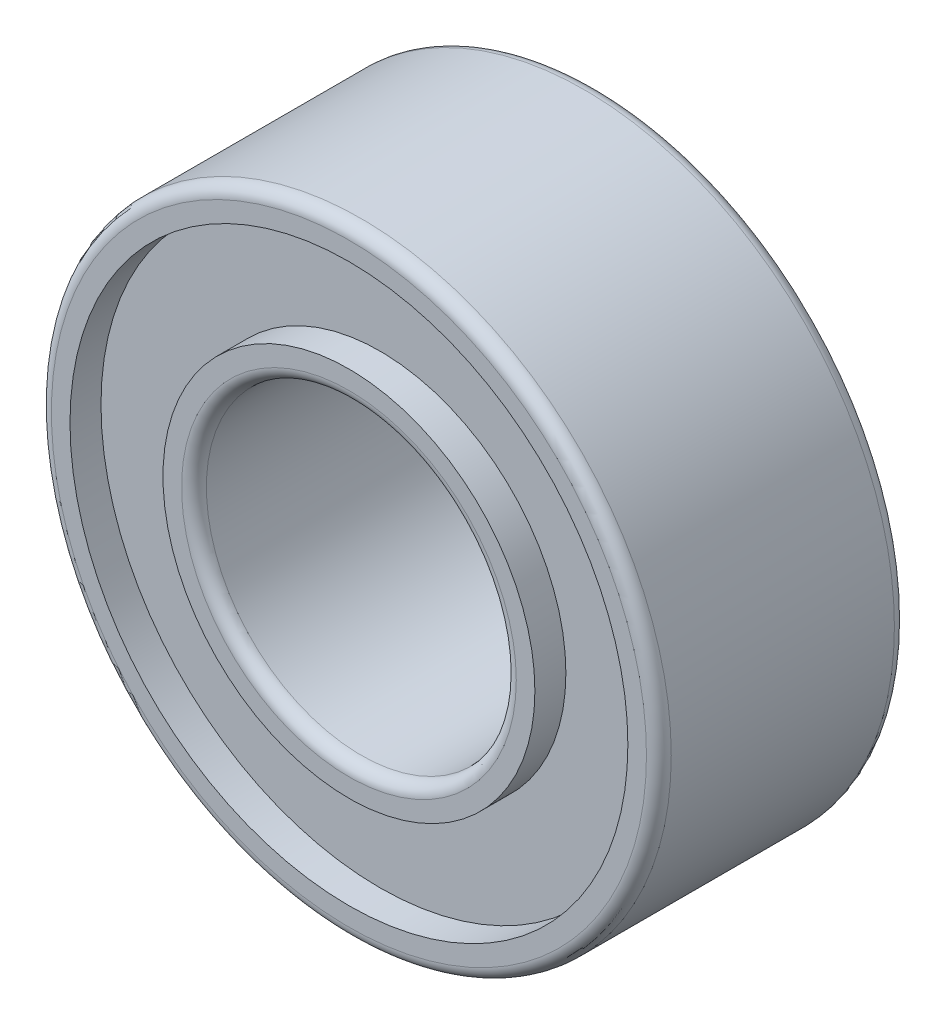
ISO-10303-21;
HEADER;
FILE_DESCRIPTION(('STEP AP214'),'2;1');
FILE_NAME('part.step','',(''),(''),'','','');
FILE_SCHEMA(('AUTOMOTIVE_DESIGN { 1 0 10303 214 1 1 1 1 }'));
ENDSEC;
DATA;
#1=APPLICATION_CONTEXT('core data for automotive mechanical design processes');
#2=APPLICATION_PROTOCOL_DEFINITION('international standard','automotive_design',2000,#1);
#3=PRODUCT_CONTEXT('',#1,'mechanical');
#4=PRODUCT('Part','Part','',(#3));
#5=PRODUCT_RELATED_PRODUCT_CATEGORY('part','',(#4));
#6=PRODUCT_DEFINITION_FORMATION('','',#4);
#7=PRODUCT_DEFINITION_CONTEXT('part definition',#1,'design');
#8=PRODUCT_DEFINITION('design','',#6,#7);
#9=PRODUCT_DEFINITION_SHAPE('','',#8);
#10=(LENGTH_UNIT() NAMED_UNIT(*) SI_UNIT(.MILLI.,.METRE.));
#11=(NAMED_UNIT(*) PLANE_ANGLE_UNIT() SI_UNIT($,.RADIAN.));
#12=(NAMED_UNIT(*) SI_UNIT($,.STERADIAN.) SOLID_ANGLE_UNIT());
#13=UNCERTAINTY_MEASURE_WITH_UNIT(LENGTH_MEASURE(1.E-05),#10,'distance_accuracy_value','');
#14=(GEOMETRIC_REPRESENTATION_CONTEXT(3) GLOBAL_UNCERTAINTY_ASSIGNED_CONTEXT((#13)) GLOBAL_UNIT_ASSIGNED_CONTEXT((#10,
#11,#12)) REPRESENTATION_CONTEXT('',''));
#15=CARTESIAN_POINT('',(0.,0.,0.));
#16=DIRECTION('',(0.,0.,1.));
#17=DIRECTION('',(1.,0.,0.));
#18=AXIS2_PLACEMENT_3D('',#15,#16,#17);
#19=CARTESIAN_POINT('',(0.,0.,4.));
#20=DIRECTION('',(0.,0.,1.));
#21=DIRECTION('',(1.,0.,0.));
#22=AXIS2_PLACEMENT_3D('',#19,#20,#21);
#23=PLANE('',#22);
#24=CARTESIAN_POINT('',(0.,0.,4.));
#25=DIRECTION('',(0.,0.,1.));
#26=DIRECTION('',(1.,0.,0.));
#27=AXIS2_PLACEMENT_3D('',#24,#25,#26);
#28=CIRCLE('',#27,2.7);
#29=CARTESIAN_POINT('',(2.7,0.,4.));
#30=VERTEX_POINT('',#29);
#31=EDGE_CURVE('E10',#30,#30,#28,.F.);
#32=ORIENTED_EDGE('',*,*,#31,.T.);
#33=EDGE_LOOP('',(#32));
#34=FACE_BOUND('',#33,.T.);
#35=CARTESIAN_POINT('',(0.,0.,4.));
#36=DIRECTION('',(0.,0.,1.));
#37=DIRECTION('',(1.,0.,0.));
#38=AXIS2_PLACEMENT_3D('',#35,#36,#37);
#39=CIRCLE('',#38,3.);
#40=CARTESIAN_POINT('',(3.,0.,4.));
#41=VERTEX_POINT('',#40);
#42=EDGE_CURVE('E85',#41,#41,#39,.T.);
#43=ORIENTED_EDGE('',*,*,#42,.T.);
#44=EDGE_LOOP('',(#43));
#45=FACE_BOUND('',#44,.T.);
#46=ADVANCED_FACE('F34',(#34,#45),#23,.T.);
#47=CARTESIAN_POINT('',(0.,0.,0.));
#48=DIRECTION('',(0.,0.,1.));
#49=DIRECTION('',(1.,0.,0.));
#50=AXIS2_PLACEMENT_3D('',#47,#48,#49);
#51=PLANE('',#50);
#52=CARTESIAN_POINT('',(0.,0.,0.));
#53=DIRECTION('',(0.,0.,1.));
#54=DIRECTION('',(1.,0.,0.));
#55=AXIS2_PLACEMENT_3D('',#52,#53,#54);
#56=CIRCLE('',#55,2.7);
#57=CARTESIAN_POINT('',(2.7,0.,0.));
#58=VERTEX_POINT('',#57);
#59=EDGE_CURVE('E60',#58,#58,#56,.T.);
#60=ORIENTED_EDGE('',*,*,#59,.T.);
#61=EDGE_LOOP('',(#60));
#62=FACE_BOUND('',#61,.T.);
#63=CARTESIAN_POINT('',(0.,0.,0.));
#64=DIRECTION('',(0.,0.,-1.));
#65=DIRECTION('',(-1.,0.,0.));
#66=AXIS2_PLACEMENT_3D('',#63,#64,#65);
#67=CIRCLE('',#66,3.);
#68=CARTESIAN_POINT('',(-3.,0.,0.));
#69=VERTEX_POINT('',#68);
#70=EDGE_CURVE('E73',#69,#69,#67,.T.);
#71=ORIENTED_EDGE('',*,*,#70,.T.);
#72=EDGE_LOOP('',(#71));
#73=FACE_BOUND('',#72,.T.);
#74=ADVANCED_FACE('F110',(#62,#73),#51,.F.);
#75=CARTESIAN_POINT('',(0.,0.,4.));
#76=DIRECTION('',(0.,0.,1.));
#77=DIRECTION('',(1.,0.,0.));
#78=AXIS2_PLACEMENT_3D('',#75,#76,#77);
#79=CIRCLE('',#78,4.5);
#80=CARTESIAN_POINT('',(4.5,0.,4.));
#81=VERTEX_POINT('',#80);
#82=EDGE_CURVE('E79',#81,#81,#79,.T.);
#83=ORIENTED_EDGE('',*,*,#82,.F.);
#84=EDGE_LOOP('',(#83));
#85=FACE_BOUND('',#84,.T.);
#86=CARTESIAN_POINT('',(0.,0.,4.));
#87=DIRECTION('',(0.,0.,1.));
#88=DIRECTION('',(1.,0.,0.));
#89=AXIS2_PLACEMENT_3D('',#86,#87,#88);
#90=CIRCLE('',#89,4.8);
#91=CARTESIAN_POINT('',(4.8,0.,4.));
#92=VERTEX_POINT('',#91);
#93=EDGE_CURVE('E41',#92,#92,#90,.T.);
#94=ORIENTED_EDGE('',*,*,#93,.T.);
#95=EDGE_LOOP('',(#94));
#96=FACE_BOUND('',#95,.T.);
#97=ADVANCED_FACE('F107',(#85,#96),#23,.T.);
#98=CARTESIAN_POINT('',(0.,0.,0.));
#99=DIRECTION('',(0.,0.,-1.));
#100=DIRECTION('',(-1.,0.,0.));
#101=AXIS2_PLACEMENT_3D('',#98,#99,#100);
#102=CIRCLE('',#101,4.5);
#103=CARTESIAN_POINT('',(-4.5,0.,0.));
#104=VERTEX_POINT('',#103);
#105=EDGE_CURVE('E67',#104,#104,#102,.T.);
#106=ORIENTED_EDGE('',*,*,#105,.F.);
#107=EDGE_LOOP('',(#106));
#108=FACE_BOUND('',#107,.T.);
#109=CARTESIAN_POINT('',(0.,0.,0.));
#110=DIRECTION('',(0.,0.,1.));
#111=DIRECTION('',(1.,0.,0.));
#112=AXIS2_PLACEMENT_3D('',#109,#110,#111);
#113=CIRCLE('',#112,4.8);
#114=CARTESIAN_POINT('',(4.8,0.,0.));
#115=VERTEX_POINT('',#114);
#116=EDGE_CURVE('E63',#115,#115,#113,.F.);
#117=ORIENTED_EDGE('',*,*,#116,.T.);
#118=EDGE_LOOP('',(#117));
#119=FACE_BOUND('',#118,.T.);
#120=ADVANCED_FACE('F109',(#108,#119),#51,.F.);
#121=CARTESIAN_POINT('',(0.,0.,4.));
#122=DIRECTION('',(0.,0.,-1.));
#123=DIRECTION('',(-1.,0.,0.));
#124=AXIS2_PLACEMENT_3D('',#121,#122,#123);
#125=CYLINDRICAL_SURFACE('',#124,5.);
#126=CARTESIAN_POINT('',(0.,0.,0.2));
#127=DIRECTION('',(0.,0.,1.));
#128=DIRECTION('',(1.,0.,0.));
#129=AXIS2_PLACEMENT_3D('',#126,#127,#128);
#130=CIRCLE('',#129,5.);
#131=CARTESIAN_POINT('',(5.,0.,0.2));
#132=VERTEX_POINT('',#131);
#133=EDGE_CURVE('E45',#132,#132,#130,.T.);
#134=ORIENTED_EDGE('',*,*,#133,.T.);
#135=EDGE_LOOP('',(#134));
#136=FACE_BOUND('',#135,.T.);
#137=CARTESIAN_POINT('',(0.,0.,3.8));
#138=DIRECTION('',(0.,0.,1.));
#139=DIRECTION('',(1.,0.,0.));
#140=AXIS2_PLACEMENT_3D('',#137,#138,#139);
#141=CIRCLE('',#140,5.);
#142=CARTESIAN_POINT('',(5.,0.,3.8));
#143=VERTEX_POINT('',#142);
#144=EDGE_CURVE('E49',#143,#143,#141,.F.);
#145=ORIENTED_EDGE('',*,*,#144,.T.);
#146=EDGE_LOOP('',(#145));
#147=FACE_BOUND('',#146,.T.);
#148=ADVANCED_FACE('F116',(#136,#147),#125,.T.);
#149=CARTESIAN_POINT('',(0.,0.,4.));
#150=DIRECTION('',(0.,0.,-1.));
#151=DIRECTION('',(-1.,0.,0.));
#152=AXIS2_PLACEMENT_3D('',#149,#150,#151);
#153=CYLINDRICAL_SURFACE('',#152,2.5);
#154=CARTESIAN_POINT('',(0.,0.,0.2));
#155=DIRECTION('',(0.,0.,1.));
#156=DIRECTION('',(1.,0.,0.));
#157=AXIS2_PLACEMENT_3D('',#154,#155,#156);
#158=CIRCLE('',#157,2.5);
#159=CARTESIAN_POINT('',(2.5,0.,0.2));
#160=VERTEX_POINT('',#159);
#161=EDGE_CURVE('E54',#160,#160,#158,.F.);
#162=ORIENTED_EDGE('',*,*,#161,.T.);
#163=EDGE_LOOP('',(#162));
#164=FACE_BOUND('',#163,.T.);
#165=CARTESIAN_POINT('',(0.,0.,3.8));
#166=DIRECTION('',(0.,0.,1.));
#167=DIRECTION('',(1.,0.,0.));
#168=AXIS2_PLACEMENT_3D('',#165,#166,#167);
#169=CIRCLE('',#168,2.5);
#170=CARTESIAN_POINT('',(2.5,0.,3.8));
#171=VERTEX_POINT('',#170);
#172=EDGE_CURVE('E57',#171,#171,#169,.T.);
#173=ORIENTED_EDGE('',*,*,#172,.T.);
#174=EDGE_LOOP('',(#173));
#175=FACE_BOUND('',#174,.T.);
#176=ADVANCED_FACE('F141',(#164,#175),#153,.F.);
#177=CARTESIAN_POINT('',(0.,0.,0.2));
#178=DIRECTION('',(0.,0.,1.));
#179=DIRECTION('',(1.,0.,0.));
#180=AXIS2_PLACEMENT_3D('',#177,#178,#179);
#181=TOROIDAL_SURFACE('',#180,2.7,0.2);
#182=ORIENTED_EDGE('',*,*,#161,.F.);
#183=EDGE_LOOP('',(#182));
#184=FACE_BOUND('',#183,.T.);
#185=ORIENTED_EDGE('',*,*,#59,.F.);
#186=EDGE_LOOP('',(#185));
#187=FACE_BOUND('',#186,.T.);
#188=ADVANCED_FACE('F143',(#184,#187),#181,.T.);
#189=CARTESIAN_POINT('',(0.,0.,0.2));
#190=DIRECTION('',(0.,0.,1.));
#191=DIRECTION('',(1.,0.,0.));
#192=AXIS2_PLACEMENT_3D('',#189,#190,#191);
#193=TOROIDAL_SURFACE('',#192,4.8,0.2);
#194=ORIENTED_EDGE('',*,*,#116,.F.);
#195=EDGE_LOOP('',(#194));
#196=FACE_BOUND('',#195,.T.);
#197=ORIENTED_EDGE('',*,*,#133,.F.);
#198=EDGE_LOOP('',(#197));
#199=FACE_BOUND('',#198,.T.);
#200=ADVANCED_FACE('F149',(#196,#199),#193,.T.);
#201=CARTESIAN_POINT('',(0.,0.,3.8));
#202=DIRECTION('',(0.,0.,1.));
#203=DIRECTION('',(1.,0.,0.));
#204=AXIS2_PLACEMENT_3D('',#201,#202,#203);
#205=TOROIDAL_SURFACE('',#204,2.7,0.2);
#206=ORIENTED_EDGE('',*,*,#31,.F.);
#207=EDGE_LOOP('',(#206));
#208=FACE_BOUND('',#207,.T.);
#209=ORIENTED_EDGE('',*,*,#172,.F.);
#210=EDGE_LOOP('',(#209));
#211=FACE_BOUND('',#210,.T.);
#212=ADVANCED_FACE('F158',(#208,#211),#205,.T.);
#213=CARTESIAN_POINT('',(0.,0.,3.8));
#214=DIRECTION('',(0.,0.,1.));
#215=DIRECTION('',(1.,0.,0.));
#216=AXIS2_PLACEMENT_3D('',#213,#214,#215);
#217=TOROIDAL_SURFACE('',#216,4.8,0.2);
#218=ORIENTED_EDGE('',*,*,#144,.F.);
#219=EDGE_LOOP('',(#218));
#220=FACE_BOUND('',#219,.T.);
#221=ORIENTED_EDGE('',*,*,#93,.F.);
#222=EDGE_LOOP('',(#221));
#223=FACE_BOUND('',#222,.T.);
#224=ADVANCED_FACE('F36',(#220,#223),#217,.T.);
#225=CARTESIAN_POINT('',(0.,0.,0.5));
#226=DIRECTION('',(0.,0.,-1.));
#227=DIRECTION('',(-1.,0.,0.));
#228=AXIS2_PLACEMENT_3D('',#225,#226,#227);
#229=CYLINDRICAL_SURFACE('',#228,4.5);
#230=CARTESIAN_POINT('',(0.,0.,0.5));
#231=DIRECTION('',(0.,0.,-1.));
#232=DIRECTION('',(-1.,0.,0.));
#233=AXIS2_PLACEMENT_3D('',#230,#231,#232);
#234=CIRCLE('',#233,4.5);
#235=CARTESIAN_POINT('',(-4.5,0.,0.5));
#236=VERTEX_POINT('',#235);
#237=EDGE_CURVE('E66',#236,#236,#234,.T.);
#238=ORIENTED_EDGE('',*,*,#237,.F.);
#239=EDGE_LOOP('',(#238));
#240=FACE_BOUND('',#239,.T.);
#241=ORIENTED_EDGE('',*,*,#105,.T.);
#242=EDGE_LOOP('',(#241));
#243=FACE_BOUND('',#242,.T.);
#244=ADVANCED_FACE('F137',(#240,#243),#229,.F.);
#245=CARTESIAN_POINT('',(0.,0.,0.5));
#246=DIRECTION('',(0.,0.,-1.));
#247=DIRECTION('',(-1.,0.,0.));
#248=AXIS2_PLACEMENT_3D('',#245,#246,#247);
#249=PLANE('',#248);
#250=CARTESIAN_POINT('',(0.,0.,0.5));
#251=DIRECTION('',(0.,0.,-1.));
#252=DIRECTION('',(-1.,0.,0.));
#253=AXIS2_PLACEMENT_3D('',#250,#251,#252);
#254=CIRCLE('',#253,3.);
#255=CARTESIAN_POINT('',(-3.,0.,0.5));
#256=VERTEX_POINT('',#255);
#257=EDGE_CURVE('E70',#256,#256,#254,.T.);
#258=ORIENTED_EDGE('',*,*,#257,.F.);
#259=EDGE_LOOP('',(#258));
#260=FACE_BOUND('',#259,.T.);
#261=ORIENTED_EDGE('',*,*,#237,.T.);
#262=EDGE_LOOP('',(#261));
#263=FACE_BOUND('',#262,.T.);
#264=ADVANCED_FACE('F133',(#260,#263),#249,.T.);
#265=CARTESIAN_POINT('',(0.,0.,0.5));
#266=DIRECTION('',(0.,0.,-1.));
#267=DIRECTION('',(-1.,0.,0.));
#268=AXIS2_PLACEMENT_3D('',#265,#266,#267);
#269=CYLINDRICAL_SURFACE('',#268,3.);
#270=ORIENTED_EDGE('',*,*,#257,.T.);
#271=EDGE_LOOP('',(#270));
#272=FACE_BOUND('',#271,.T.);
#273=ORIENTED_EDGE('',*,*,#70,.F.);
#274=EDGE_LOOP('',(#273));
#275=FACE_BOUND('',#274,.T.);
#276=ADVANCED_FACE('F103',(#272,#275),#269,.T.);
#277=CARTESIAN_POINT('',(0.,0.,3.5));
#278=DIRECTION('',(0.,0.,1.));
#279=DIRECTION('',(1.,0.,0.));
#280=AXIS2_PLACEMENT_3D('',#277,#278,#279);
#281=CYLINDRICAL_SURFACE('',#280,4.5);
#282=CARTESIAN_POINT('',(0.,0.,3.5));
#283=DIRECTION('',(0.,0.,1.));
#284=DIRECTION('',(1.,0.,0.));
#285=AXIS2_PLACEMENT_3D('',#282,#283,#284);
#286=CIRCLE('',#285,4.5);
#287=CARTESIAN_POINT('',(4.5,0.,3.5));
#288=VERTEX_POINT('',#287);
#289=EDGE_CURVE('E76',#288,#288,#286,.T.);
#290=ORIENTED_EDGE('',*,*,#289,.F.);
#291=EDGE_LOOP('',(#290));
#292=FACE_BOUND('',#291,.T.);
#293=ORIENTED_EDGE('',*,*,#82,.T.);
#294=EDGE_LOOP('',(#293));
#295=FACE_BOUND('',#294,.T.);
#296=ADVANCED_FACE('F97',(#292,#295),#281,.F.);
#297=CARTESIAN_POINT('',(0.,0.,3.5));
#298=DIRECTION('',(0.,0.,1.));
#299=DIRECTION('',(1.,0.,0.));
#300=AXIS2_PLACEMENT_3D('',#297,#298,#299);
#301=PLANE('',#300);
#302=CARTESIAN_POINT('',(0.,0.,3.5));
#303=DIRECTION('',(0.,0.,1.));
#304=DIRECTION('',(1.,0.,0.));
#305=AXIS2_PLACEMENT_3D('',#302,#303,#304);
#306=CIRCLE('',#305,3.);
#307=CARTESIAN_POINT('',(3.,0.,3.5));
#308=VERTEX_POINT('',#307);
#309=EDGE_CURVE('E82',#308,#308,#306,.T.);
#310=ORIENTED_EDGE('',*,*,#309,.F.);
#311=EDGE_LOOP('',(#310));
#312=FACE_BOUND('',#311,.T.);
#313=ORIENTED_EDGE('',*,*,#289,.T.);
#314=EDGE_LOOP('',(#313));
#315=FACE_BOUND('',#314,.T.);
#316=ADVANCED_FACE('F94',(#312,#315),#301,.T.);
#317=CARTESIAN_POINT('',(0.,0.,3.5));
#318=DIRECTION('',(0.,0.,1.));
#319=DIRECTION('',(1.,0.,0.));
#320=AXIS2_PLACEMENT_3D('',#317,#318,#319);
#321=CYLINDRICAL_SURFACE('',#320,3.);
#322=ORIENTED_EDGE('',*,*,#309,.T.);
#323=EDGE_LOOP('',(#322));
#324=FACE_BOUND('',#323,.T.);
#325=ORIENTED_EDGE('',*,*,#42,.F.);
#326=EDGE_LOOP('',(#325));
#327=FACE_BOUND('',#326,.T.);
#328=ADVANCED_FACE('F91',(#324,#327),#321,.T.);
#329=CLOSED_SHELL('',(#46,#74,#97,#120,#148,#176,#188,#200,#212,#224,#244,#264,#276,#296,#316,#328));
#330=MANIFOLD_SOLID_BREP('B2',#329);
#331=ADVANCED_BREP_SHAPE_REPRESENTATION('',(#18,#330),#14);
#332=SHAPE_DEFINITION_REPRESENTATION(#9,#331);
ENDSEC;
END-ISO-10303-21;
